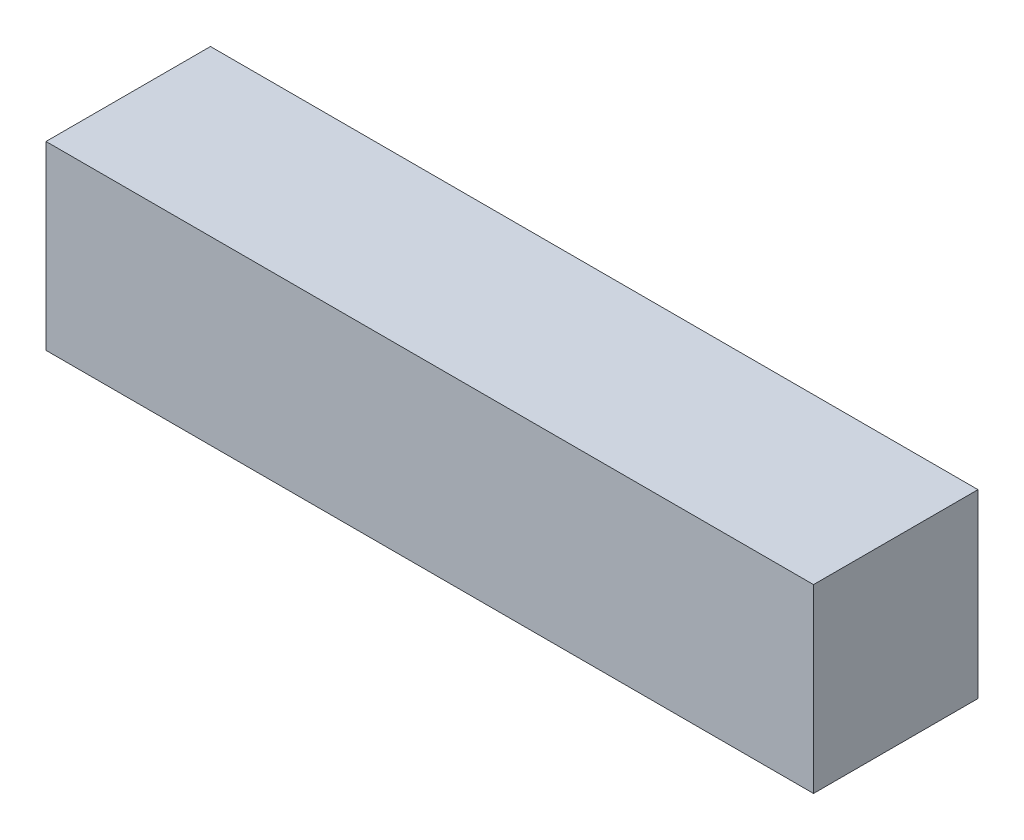
ISO-10303-21;
HEADER;
FILE_DESCRIPTION(('STEP AP214'),'2;1');
FILE_NAME('part.step','',(''),(''),'','','');
FILE_SCHEMA(('AUTOMOTIVE_DESIGN { 1 0 10303 214 1 1 1 1 }'));
ENDSEC;
DATA;
#1=APPLICATION_CONTEXT('core data for automotive mechanical design processes');
#2=APPLICATION_PROTOCOL_DEFINITION('international standard','automotive_design',2000,#1);
#3=PRODUCT_CONTEXT('',#1,'mechanical');
#4=PRODUCT('Part','Part','',(#3));
#5=PRODUCT_RELATED_PRODUCT_CATEGORY('part','',(#4));
#6=PRODUCT_DEFINITION_FORMATION('','',#4);
#7=PRODUCT_DEFINITION_CONTEXT('part definition',#1,'design');
#8=PRODUCT_DEFINITION('design','',#6,#7);
#9=PRODUCT_DEFINITION_SHAPE('','',#8);
#10=(LENGTH_UNIT() NAMED_UNIT(*) SI_UNIT(.MILLI.,.METRE.));
#11=(NAMED_UNIT(*) PLANE_ANGLE_UNIT() SI_UNIT($,.RADIAN.));
#12=(NAMED_UNIT(*) SI_UNIT($,.STERADIAN.) SOLID_ANGLE_UNIT());
#13=UNCERTAINTY_MEASURE_WITH_UNIT(LENGTH_MEASURE(1.E-05),#10,'distance_accuracy_value','');
#14=(GEOMETRIC_REPRESENTATION_CONTEXT(3) GLOBAL_UNCERTAINTY_ASSIGNED_CONTEXT((#13)) GLOBAL_UNIT_ASSIGNED_CONTEXT((#10,
#11,#12)) REPRESENTATION_CONTEXT('',''));
#15=CARTESIAN_POINT('',(0.,0.,0.));
#16=DIRECTION('',(0.,0.,1.));
#17=DIRECTION('',(1.,0.,0.));
#18=AXIS2_PLACEMENT_3D('',#15,#16,#17);
#19=CARTESIAN_POINT('',(0.,0.,19.05));
#20=DIRECTION('',(1.,0.,0.));
#21=DIRECTION('',(0.,0.,-1.));
#22=AXIS2_PLACEMENT_3D('',#19,#20,#21);
#23=PLANE('',#22);
#24=DIRECTION('',(0.,-1.,0.));
#25=VECTOR('',#24,1.);
#26=CARTESIAN_POINT('',(0.,0.,0.));
#27=LINE('',#26,#25);
#28=CARTESIAN_POINT('',(0.,0.,0.));
#29=VERTEX_POINT('',#28);
#30=CARTESIAN_POINT('',(0.,-20.955,0.));
#31=VERTEX_POINT('',#30);
#32=EDGE_CURVE('E102',#29,#31,#27,.T.);
#33=ORIENTED_EDGE('',*,*,#32,.T.);
#34=DIRECTION('',(0.,0.,-1.));
#35=VECTOR('',#34,1.);
#36=CARTESIAN_POINT('',(0.,-20.955,19.05));
#37=LINE('',#36,#35);
#38=CARTESIAN_POINT('',(0.,-20.955,19.05));
#39=VERTEX_POINT('',#38);
#40=EDGE_CURVE('E11',#39,#31,#37,.T.);
#41=ORIENTED_EDGE('',*,*,#40,.F.);
#42=DIRECTION('',(0.,-1.,0.));
#43=VECTOR('',#42,1.);
#44=CARTESIAN_POINT('',(0.,0.,19.05));
#45=LINE('',#44,#43);
#46=CARTESIAN_POINT('',(0.,0.,19.05));
#47=VERTEX_POINT('',#46);
#48=EDGE_CURVE('E90',#47,#39,#45,.T.);
#49=ORIENTED_EDGE('',*,*,#48,.F.);
#50=DIRECTION('',(0.,0.,-1.));
#51=VECTOR('',#50,1.);
#52=CARTESIAN_POINT('',(0.,0.,19.05));
#53=LINE('',#52,#51);
#54=EDGE_CURVE('E98',#47,#29,#53,.T.);
#55=ORIENTED_EDGE('',*,*,#54,.T.);
#56=EDGE_LOOP('',(#33,#41,#49,#55));
#57=FACE_BOUND('',#56,.T.);
#58=ADVANCED_FACE('F39',(#57),#23,.F.);
#59=CARTESIAN_POINT('',(0.,-20.955,19.05));
#60=DIRECTION('',(0.,1.,0.));
#61=DIRECTION('',(0.,0.,1.));
#62=AXIS2_PLACEMENT_3D('',#59,#60,#61);
#63=PLANE('',#62);
#64=DIRECTION('',(1.,0.,0.));
#65=VECTOR('',#64,1.);
#66=CARTESIAN_POINT('',(0.,-20.955,0.));
#67=LINE('',#66,#65);
#68=CARTESIAN_POINT('',(88.9,-20.955,0.));
#69=VERTEX_POINT('',#68);
#70=EDGE_CURVE('E94',#31,#69,#67,.T.);
#71=ORIENTED_EDGE('',*,*,#70,.T.);
#72=DIRECTION('',(0.,0.,-1.));
#73=VECTOR('',#72,1.);
#74=CARTESIAN_POINT('',(88.9,-20.955,19.05));
#75=LINE('',#74,#73);
#76=CARTESIAN_POINT('',(88.9,-20.955,19.05));
#77=VERTEX_POINT('',#76);
#78=EDGE_CURVE('E47',#77,#69,#75,.T.);
#79=ORIENTED_EDGE('',*,*,#78,.F.);
#80=DIRECTION('',(1.,0.,0.));
#81=VECTOR('',#80,1.);
#82=CARTESIAN_POINT('',(0.,-20.955,19.05));
#83=LINE('',#82,#81);
#84=EDGE_CURVE('E85',#39,#77,#83,.T.);
#85=ORIENTED_EDGE('',*,*,#84,.F.);
#86=ORIENTED_EDGE('',*,*,#40,.T.);
#87=EDGE_LOOP('',(#71,#79,#85,#86));
#88=FACE_BOUND('',#87,.T.);
#89=ADVANCED_FACE('F93',(#88),#63,.F.);
#90=CARTESIAN_POINT('',(88.9,0.,19.05));
#91=DIRECTION('',(-1.,0.,0.));
#92=DIRECTION('',(0.,0.,1.));
#93=AXIS2_PLACEMENT_3D('',#90,#91,#92);
#94=PLANE('',#93);
#95=DIRECTION('',(0.,1.,0.));
#96=VECTOR('',#95,1.);
#97=CARTESIAN_POINT('',(88.9,0.,0.));
#98=LINE('',#97,#96);
#99=CARTESIAN_POINT('',(88.9,0.,0.));
#100=VERTEX_POINT('',#99);
#101=EDGE_CURVE('E72',#69,#100,#98,.T.);
#102=ORIENTED_EDGE('',*,*,#101,.T.);
#103=DIRECTION('',(0.,0.,-1.));
#104=VECTOR('',#103,1.);
#105=CARTESIAN_POINT('',(88.9,0.,19.05));
#106=LINE('',#105,#104);
#107=CARTESIAN_POINT('',(88.9,0.,19.05));
#108=VERTEX_POINT('',#107);
#109=EDGE_CURVE('E95',#108,#100,#106,.T.);
#110=ORIENTED_EDGE('',*,*,#109,.F.);
#111=DIRECTION('',(0.,1.,0.));
#112=VECTOR('',#111,1.);
#113=CARTESIAN_POINT('',(88.9,0.,19.05));
#114=LINE('',#113,#112);
#115=EDGE_CURVE('E88',#77,#108,#114,.T.);
#116=ORIENTED_EDGE('',*,*,#115,.F.);
#117=ORIENTED_EDGE('',*,*,#78,.T.);
#118=EDGE_LOOP('',(#102,#110,#116,#117));
#119=FACE_BOUND('',#118,.T.);
#120=ADVANCED_FACE('F96',(#119),#94,.F.);
#121=CARTESIAN_POINT('',(0.,0.,19.05));
#122=DIRECTION('',(0.,-1.,0.));
#123=DIRECTION('',(0.,0.,-1.));
#124=AXIS2_PLACEMENT_3D('',#121,#122,#123);
#125=PLANE('',#124);
#126=DIRECTION('',(-1.,0.,0.));
#127=VECTOR('',#126,1.);
#128=CARTESIAN_POINT('',(0.,0.,0.));
#129=LINE('',#128,#127);
#130=EDGE_CURVE('E78',#100,#29,#129,.T.);
#131=ORIENTED_EDGE('',*,*,#130,.T.);
#132=ORIENTED_EDGE('',*,*,#54,.F.);
#133=DIRECTION('',(-1.,0.,0.));
#134=VECTOR('',#133,1.);
#135=CARTESIAN_POINT('',(0.,0.,19.05));
#136=LINE('',#135,#134);
#137=EDGE_CURVE('E55',#108,#47,#136,.T.);
#138=ORIENTED_EDGE('',*,*,#137,.F.);
#139=ORIENTED_EDGE('',*,*,#109,.T.);
#140=EDGE_LOOP('',(#131,#132,#138,#139));
#141=FACE_BOUND('',#140,.T.);
#142=ADVANCED_FACE('F109',(#141),#125,.F.);
#143=CARTESIAN_POINT('',(0.,0.,19.05));
#144=DIRECTION('',(0.,0.,1.));
#145=DIRECTION('',(1.,0.,0.));
#146=AXIS2_PLACEMENT_3D('',#143,#144,#145);
#147=PLANE('',#146);
#148=ORIENTED_EDGE('',*,*,#48,.T.);
#149=ORIENTED_EDGE('',*,*,#84,.T.);
#150=ORIENTED_EDGE('',*,*,#115,.T.);
#151=ORIENTED_EDGE('',*,*,#137,.T.);
#152=EDGE_LOOP('',(#148,#149,#150,#151));
#153=FACE_BOUND('',#152,.T.);
#154=ADVANCED_FACE('F86',(#153),#147,.T.);
#155=CARTESIAN_POINT('',(0.,0.,0.));
#156=DIRECTION('',(0.,0.,1.));
#157=DIRECTION('',(1.,0.,0.));
#158=AXIS2_PLACEMENT_3D('',#155,#156,#157);
#159=PLANE('',#158);
#160=ORIENTED_EDGE('',*,*,#32,.F.);
#161=ORIENTED_EDGE('',*,*,#130,.F.);
#162=ORIENTED_EDGE('',*,*,#101,.F.);
#163=ORIENTED_EDGE('',*,*,#70,.F.);
#164=EDGE_LOOP('',(#160,#161,#162,#163));
#165=FACE_BOUND('',#164,.T.);
#166=ADVANCED_FACE('F112',(#165),#159,.F.);
#167=CLOSED_SHELL('',(#58,#89,#120,#142,#154,#166));
#168=MANIFOLD_SOLID_BREP('B2',#167);
#169=ADVANCED_BREP_SHAPE_REPRESENTATION('',(#18,#168),#14);
#170=SHAPE_DEFINITION_REPRESENTATION(#9,#169);
ENDSEC;
END-ISO-10303-21;
